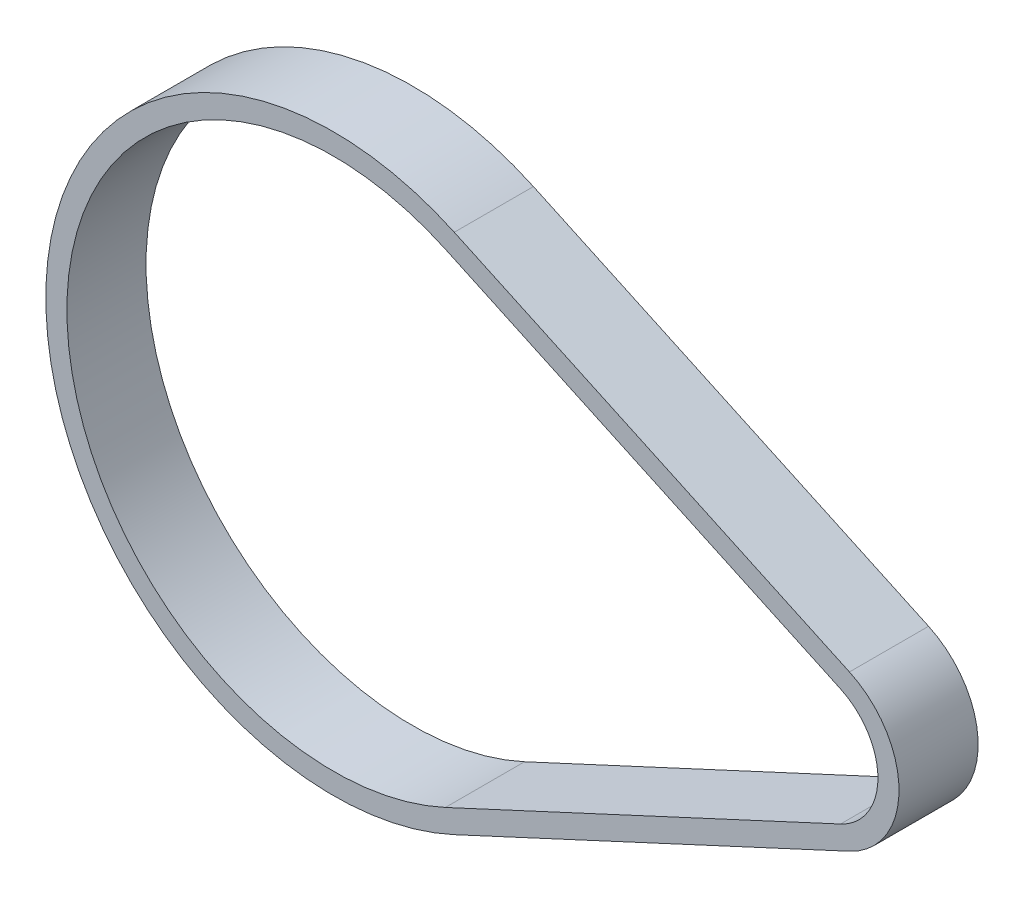
ISO-10303-21;
HEADER;
FILE_DESCRIPTION(('STEP AP214'),'2;1');
FILE_NAME('part.step','',(''),(''),'','','');
FILE_SCHEMA(('AUTOMOTIVE_DESIGN { 1 0 10303 214 1 1 1 1 }'));
ENDSEC;
DATA;
#1=APPLICATION_CONTEXT('core data for automotive mechanical design processes');
#2=APPLICATION_PROTOCOL_DEFINITION('international standard','automotive_design',2000,#1);
#3=PRODUCT_CONTEXT('',#1,'mechanical');
#4=PRODUCT('Part','Part','',(#3));
#5=PRODUCT_RELATED_PRODUCT_CATEGORY('part','',(#4));
#6=PRODUCT_DEFINITION_FORMATION('','',#4);
#7=PRODUCT_DEFINITION_CONTEXT('part definition',#1,'design');
#8=PRODUCT_DEFINITION('design','',#6,#7);
#9=PRODUCT_DEFINITION_SHAPE('','',#8);
#10=(LENGTH_UNIT() NAMED_UNIT(*) SI_UNIT(.MILLI.,.METRE.));
#11=(NAMED_UNIT(*) PLANE_ANGLE_UNIT() SI_UNIT($,.RADIAN.));
#12=(NAMED_UNIT(*) SI_UNIT($,.STERADIAN.) SOLID_ANGLE_UNIT());
#13=UNCERTAINTY_MEASURE_WITH_UNIT(LENGTH_MEASURE(1.E-05),#10,'distance_accuracy_value','');
#14=(GEOMETRIC_REPRESENTATION_CONTEXT(3) GLOBAL_UNCERTAINTY_ASSIGNED_CONTEXT((#13)) GLOBAL_UNIT_ASSIGNED_CONTEXT((#10,
#11,#12)) REPRESENTATION_CONTEXT('',''));
#15=CARTESIAN_POINT('',(0.,0.,0.));
#16=DIRECTION('',(0.,0.,1.));
#17=DIRECTION('',(1.,0.,0.));
#18=AXIS2_PLACEMENT_3D('',#15,#16,#17);
#19=CARTESIAN_POINT('',(-22.75,0.,7.5));
#20=DIRECTION('',(0.,0.,1.));
#21=DIRECTION('',(1.,0.,0.));
#22=AXIS2_PLACEMENT_3D('',#19,#20,#21);
#23=PLANE('',#22);
#24=CARTESIAN_POINT('',(-22.75,0.,7.5));
#25=DIRECTION('',(0.,0.,1.));
#26=DIRECTION('',(1.,0.,0.));
#27=AXIS2_PLACEMENT_3D('',#24,#25,#26);
#28=CIRCLE('',#27,27.25);
#29=CARTESIAN_POINT('',(-11.287032967033,24.7217088163644,7.5));
#30=VERTEX_POINT('',#29);
#31=CARTESIAN_POINT('',(-11.287032967033,-24.7217088163644,7.5));
#32=VERTEX_POINT('',#31);
#33=EDGE_CURVE('E153',#30,#32,#28,.T.);
#34=ORIENTED_EDGE('',*,*,#33,.T.);
#35=DIRECTION('',(0.907218672160163,0.420659340659341,0.));
#36=VECTOR('',#35,1.);
#37=CARTESIAN_POINT('',(26.1615472527473,-7.35754343121891,7.5));
#38=LINE('',#37,#36);
#39=CARTESIAN_POINT('',(26.1615472527473,-7.35754343121891,7.5));
#40=VERTEX_POINT('',#39);
#41=EDGE_CURVE('E157',#32,#40,#38,.T.);
#42=ORIENTED_EDGE('',*,*,#41,.T.);
#43=CARTESIAN_POINT('',(22.75,0.,7.5));
#44=DIRECTION('',(0.,0.,1.));
#45=DIRECTION('',(-1.,0.,0.));
#46=AXIS2_PLACEMENT_3D('',#43,#44,#45);
#47=CIRCLE('',#46,8.11);
#48=CARTESIAN_POINT('',(26.1615472527473,7.35754343121893,7.5));
#49=VERTEX_POINT('',#48);
#50=EDGE_CURVE('E161',#40,#49,#47,.T.);
#51=ORIENTED_EDGE('',*,*,#50,.T.);
#52=DIRECTION('',(-0.907218672160163,0.42065934065934,0.));
#53=VECTOR('',#52,1.);
#54=CARTESIAN_POINT('',(-11.287032967033,24.7217088163644,7.5));
#55=LINE('',#54,#53);
#56=EDGE_CURVE('E164',#49,#30,#55,.T.);
#57=ORIENTED_EDGE('',*,*,#56,.T.);
#58=EDGE_LOOP('',(#34,#42,#51,#57));
#59=FACE_BOUND('',#58,.T.);
#60=DIRECTION('',(0.907218672160163,0.420659340659341,0.));
#61=VECTOR('',#60,1.);
#62=CARTESIAN_POINT('',(25.3202285714286,-5.54310608689859,7.5));
#63=LINE('',#62,#61);
#64=CARTESIAN_POINT('',(-12.1283516483516,-22.9072714720441,7.5));
#65=VERTEX_POINT('',#64);
#66=CARTESIAN_POINT('',(25.3202285714286,-5.54310608689859,7.5));
#67=VERTEX_POINT('',#66);
#68=EDGE_CURVE('E114',#65,#67,#63,.T.);
#69=ORIENTED_EDGE('',*,*,#68,.F.);
#70=CARTESIAN_POINT('',(-22.75,0.,7.5));
#71=DIRECTION('',(0.,0.,1.));
#72=DIRECTION('',(1.,0.,0.));
#73=AXIS2_PLACEMENT_3D('',#70,#71,#72);
#74=CIRCLE('',#73,25.25);
#75=CARTESIAN_POINT('',(-12.1283516483517,22.9072714720441,7.5));
#76=VERTEX_POINT('',#75);
#77=EDGE_CURVE('E105',#76,#65,#74,.T.);
#78=ORIENTED_EDGE('',*,*,#77,.F.);
#79=DIRECTION('',(-0.907218672160163,0.420659340659341,0.));
#80=VECTOR('',#79,1.);
#81=CARTESIAN_POINT('',(-12.1283516483517,22.9072714720441,7.5));
#82=LINE('',#81,#80);
#83=CARTESIAN_POINT('',(25.3202285714286,5.54310608689861,7.5));
#84=VERTEX_POINT('',#83);
#85=EDGE_CURVE('E131',#84,#76,#82,.T.);
#86=ORIENTED_EDGE('',*,*,#85,.F.);
#87=CARTESIAN_POINT('',(22.75,0.,7.5));
#88=DIRECTION('',(0.,0.,1.));
#89=DIRECTION('',(-1.,0.,0.));
#90=AXIS2_PLACEMENT_3D('',#87,#88,#89);
#91=CIRCLE('',#90,6.11000000000001);
#92=EDGE_CURVE('E127',#67,#84,#91,.T.);
#93=ORIENTED_EDGE('',*,*,#92,.F.);
#94=EDGE_LOOP('',(#69,#78,#86,#93));
#95=FACE_BOUND('',#94,.T.);
#96=ADVANCED_FACE('F39',(#59,#95),#23,.T.);
#97=CARTESIAN_POINT('',(-22.75,0.,0.));
#98=DIRECTION('',(0.,0.,1.));
#99=DIRECTION('',(1.,0.,0.));
#100=AXIS2_PLACEMENT_3D('',#97,#98,#99);
#101=PLANE('',#100);
#102=CARTESIAN_POINT('',(-22.75,0.,0.));
#103=DIRECTION('',(0.,0.,1.));
#104=DIRECTION('',(1.,0.,0.));
#105=AXIS2_PLACEMENT_3D('',#102,#103,#104);
#106=CIRCLE('',#105,27.25);
#107=CARTESIAN_POINT('',(-11.287032967033,24.7217088163644,0.));
#108=VERTEX_POINT('',#107);
#109=CARTESIAN_POINT('',(-11.287032967033,-24.7217088163644,0.));
#110=VERTEX_POINT('',#109);
#111=EDGE_CURVE('E123',#108,#110,#106,.T.);
#112=ORIENTED_EDGE('',*,*,#111,.F.);
#113=DIRECTION('',(-0.907218672160163,0.42065934065934,0.));
#114=VECTOR('',#113,1.);
#115=CARTESIAN_POINT('',(-11.287032967033,24.7217088163644,0.));
#116=LINE('',#115,#114);
#117=CARTESIAN_POINT('',(26.1615472527473,7.35754343121893,0.));
#118=VERTEX_POINT('',#117);
#119=EDGE_CURVE('E158',#118,#108,#116,.T.);
#120=ORIENTED_EDGE('',*,*,#119,.F.);
#121=CARTESIAN_POINT('',(22.75,0.,0.));
#122=DIRECTION('',(0.,0.,1.));
#123=DIRECTION('',(-1.,0.,0.));
#124=AXIS2_PLACEMENT_3D('',#121,#122,#123);
#125=CIRCLE('',#124,8.11);
#126=CARTESIAN_POINT('',(26.1615472527473,-7.35754343121891,0.));
#127=VERTEX_POINT('',#126);
#128=EDGE_CURVE('E174',#127,#118,#125,.T.);
#129=ORIENTED_EDGE('',*,*,#128,.F.);
#130=DIRECTION('',(0.907218672160163,0.420659340659341,0.));
#131=VECTOR('',#130,1.);
#132=CARTESIAN_POINT('',(26.1615472527473,-7.35754343121891,0.));
#133=LINE('',#132,#131);
#134=EDGE_CURVE('E171',#110,#127,#133,.T.);
#135=ORIENTED_EDGE('',*,*,#134,.F.);
#136=EDGE_LOOP('',(#112,#120,#129,#135));
#137=FACE_BOUND('',#136,.T.);
#138=CARTESIAN_POINT('',(-22.75,0.,0.));
#139=DIRECTION('',(0.,0.,1.));
#140=DIRECTION('',(1.,0.,0.));
#141=AXIS2_PLACEMENT_3D('',#138,#139,#140);
#142=CIRCLE('',#141,25.25);
#143=CARTESIAN_POINT('',(-12.1283516483517,22.9072714720441,0.));
#144=VERTEX_POINT('',#143);
#145=CARTESIAN_POINT('',(-12.1283516483516,-22.9072714720441,0.));
#146=VERTEX_POINT('',#145);
#147=EDGE_CURVE('E63',#144,#146,#142,.T.);
#148=ORIENTED_EDGE('',*,*,#147,.T.);
#149=DIRECTION('',(0.907218672160163,0.420659340659341,0.));
#150=VECTOR('',#149,1.);
#151=CARTESIAN_POINT('',(25.3202285714286,-5.54310608689859,0.));
#152=LINE('',#151,#150);
#153=CARTESIAN_POINT('',(25.3202285714286,-5.54310608689859,0.));
#154=VERTEX_POINT('',#153);
#155=EDGE_CURVE('E121',#146,#154,#152,.T.);
#156=ORIENTED_EDGE('',*,*,#155,.T.);
#157=CARTESIAN_POINT('',(22.75,0.,0.));
#158=DIRECTION('',(0.,0.,1.));
#159=DIRECTION('',(-1.,0.,0.));
#160=AXIS2_PLACEMENT_3D('',#157,#158,#159);
#161=CIRCLE('',#160,6.11000000000001);
#162=CARTESIAN_POINT('',(25.3202285714286,5.54310608689861,0.));
#163=VERTEX_POINT('',#162);
#164=EDGE_CURVE('E140',#154,#163,#161,.T.);
#165=ORIENTED_EDGE('',*,*,#164,.T.);
#166=DIRECTION('',(-0.907218672160163,0.420659340659341,0.));
#167=VECTOR('',#166,1.);
#168=CARTESIAN_POINT('',(-12.1283516483517,22.9072714720441,0.));
#169=LINE('',#168,#167);
#170=EDGE_CURVE('E115',#163,#144,#169,.T.);
#171=ORIENTED_EDGE('',*,*,#170,.T.);
#172=EDGE_LOOP('',(#148,#156,#165,#171));
#173=FACE_BOUND('',#172,.T.);
#174=ADVANCED_FACE('F197',(#137,#173),#101,.F.);
#175=CARTESIAN_POINT('',(-22.75,0.,7.5));
#176=DIRECTION('',(0.,0.,-1.));
#177=DIRECTION('',(-1.,0.,0.));
#178=AXIS2_PLACEMENT_3D('',#175,#176,#177);
#179=CYLINDRICAL_SURFACE('',#178,27.25);
#180=ORIENTED_EDGE('',*,*,#111,.T.);
#181=DIRECTION('',(0.,0.,-1.));
#182=VECTOR('',#181,1.);
#183=CARTESIAN_POINT('',(-11.287032967033,-24.7217088163644,7.5));
#184=LINE('',#183,#182);
#185=EDGE_CURVE('E11',#32,#110,#184,.T.);
#186=ORIENTED_EDGE('',*,*,#185,.F.);
#187=ORIENTED_EDGE('',*,*,#33,.F.);
#188=DIRECTION('',(0.,0.,-1.));
#189=VECTOR('',#188,1.);
#190=CARTESIAN_POINT('',(-11.287032967033,24.7217088163644,7.5));
#191=LINE('',#190,#189);
#192=EDGE_CURVE('E167',#30,#108,#191,.T.);
#193=ORIENTED_EDGE('',*,*,#192,.T.);
#194=EDGE_LOOP('',(#180,#186,#187,#193));
#195=FACE_BOUND('',#194,.T.);
#196=ADVANCED_FACE('F41',(#195),#179,.T.);
#197=CARTESIAN_POINT('',(26.1615472527473,-7.35754343121891,7.5));
#198=DIRECTION('',(-0.420659340659341,0.907218672160163,0.));
#199=DIRECTION('',(-0.907218672160163,-0.420659340659341,0.));
#200=AXIS2_PLACEMENT_3D('',#197,#198,#199);
#201=PLANE('',#200);
#202=ORIENTED_EDGE('',*,*,#134,.T.);
#203=DIRECTION('',(0.,0.,-1.));
#204=VECTOR('',#203,1.);
#205=CARTESIAN_POINT('',(26.1615472527473,-7.35754343121891,7.5));
#206=LINE('',#205,#204);
#207=EDGE_CURVE('E48',#40,#127,#206,.T.);
#208=ORIENTED_EDGE('',*,*,#207,.F.);
#209=ORIENTED_EDGE('',*,*,#41,.F.);
#210=ORIENTED_EDGE('',*,*,#185,.T.);
#211=EDGE_LOOP('',(#202,#208,#209,#210));
#212=FACE_BOUND('',#211,.T.);
#213=ADVANCED_FACE('F207',(#212),#201,.F.);
#214=CARTESIAN_POINT('',(22.75,0.,7.5));
#215=DIRECTION('',(0.,0.,-1.));
#216=DIRECTION('',(-1.,0.,0.));
#217=AXIS2_PLACEMENT_3D('',#214,#215,#216);
#218=CYLINDRICAL_SURFACE('',#217,8.11);
#219=ORIENTED_EDGE('',*,*,#128,.T.);
#220=DIRECTION('',(0.,0.,-1.));
#221=VECTOR('',#220,1.);
#222=CARTESIAN_POINT('',(26.1615472527473,7.35754343121893,7.5));
#223=LINE('',#222,#221);
#224=EDGE_CURVE('E182',#49,#118,#223,.T.);
#225=ORIENTED_EDGE('',*,*,#224,.F.);
#226=ORIENTED_EDGE('',*,*,#50,.F.);
#227=ORIENTED_EDGE('',*,*,#207,.T.);
#228=EDGE_LOOP('',(#219,#225,#226,#227));
#229=FACE_BOUND('',#228,.T.);
#230=ADVANCED_FACE('F191',(#229),#218,.T.);
#231=CARTESIAN_POINT('',(-11.287032967033,24.7217088163644,7.5));
#232=DIRECTION('',(-0.42065934065934,-0.907218672160163,0.));
#233=DIRECTION('',(0.907218672160163,-0.42065934065934,0.));
#234=AXIS2_PLACEMENT_3D('',#231,#232,#233);
#235=PLANE('',#234);
#236=ORIENTED_EDGE('',*,*,#119,.T.);
#237=ORIENTED_EDGE('',*,*,#192,.F.);
#238=ORIENTED_EDGE('',*,*,#56,.F.);
#239=ORIENTED_EDGE('',*,*,#224,.T.);
#240=EDGE_LOOP('',(#236,#237,#238,#239));
#241=FACE_BOUND('',#240,.T.);
#242=ADVANCED_FACE('F201',(#241),#235,.F.);
#243=CARTESIAN_POINT('',(-22.75,0.,7.5));
#244=DIRECTION('',(0.,0.,-1.));
#245=DIRECTION('',(-1.,0.,0.));
#246=AXIS2_PLACEMENT_3D('',#243,#244,#245);
#247=CYLINDRICAL_SURFACE('',#246,25.25);
#248=ORIENTED_EDGE('',*,*,#147,.F.);
#249=DIRECTION('',(0.,0.,-1.));
#250=VECTOR('',#249,1.);
#251=CARTESIAN_POINT('',(-12.1283516483517,22.9072714720441,7.5));
#252=LINE('',#251,#250);
#253=EDGE_CURVE('E109',#76,#144,#252,.T.);
#254=ORIENTED_EDGE('',*,*,#253,.F.);
#255=ORIENTED_EDGE('',*,*,#77,.T.);
#256=DIRECTION('',(0.,0.,-1.));
#257=VECTOR('',#256,1.);
#258=CARTESIAN_POINT('',(-12.1283516483516,-22.9072714720441,7.5));
#259=LINE('',#258,#257);
#260=EDGE_CURVE('E108',#65,#146,#259,.T.);
#261=ORIENTED_EDGE('',*,*,#260,.T.);
#262=EDGE_LOOP('',(#248,#254,#255,#261));
#263=FACE_BOUND('',#262,.T.);
#264=ADVANCED_FACE('F107',(#263),#247,.F.);
#265=CARTESIAN_POINT('',(25.3202285714286,-5.54310608689859,7.5));
#266=DIRECTION('',(-0.420659340659341,0.907218672160163,0.));
#267=DIRECTION('',(-0.907218672160163,-0.420659340659341,0.));
#268=AXIS2_PLACEMENT_3D('',#265,#266,#267);
#269=PLANE('',#268);
#270=ORIENTED_EDGE('',*,*,#155,.F.);
#271=ORIENTED_EDGE('',*,*,#260,.F.);
#272=ORIENTED_EDGE('',*,*,#68,.T.);
#273=DIRECTION('',(0.,0.,-1.));
#274=VECTOR('',#273,1.);
#275=CARTESIAN_POINT('',(25.3202285714286,-5.54310608689859,7.5));
#276=LINE('',#275,#274);
#277=EDGE_CURVE('E124',#67,#154,#276,.T.);
#278=ORIENTED_EDGE('',*,*,#277,.T.);
#279=EDGE_LOOP('',(#270,#271,#272,#278));
#280=FACE_BOUND('',#279,.T.);
#281=ADVANCED_FACE('F118',(#280),#269,.T.);
#282=CARTESIAN_POINT('',(22.75,0.,7.5));
#283=DIRECTION('',(0.,0.,-1.));
#284=DIRECTION('',(-1.,0.,0.));
#285=AXIS2_PLACEMENT_3D('',#282,#283,#284);
#286=CYLINDRICAL_SURFACE('',#285,6.11000000000001);
#287=ORIENTED_EDGE('',*,*,#164,.F.);
#288=ORIENTED_EDGE('',*,*,#277,.F.);
#289=ORIENTED_EDGE('',*,*,#92,.T.);
#290=DIRECTION('',(0.,0.,-1.));
#291=VECTOR('',#290,1.);
#292=CARTESIAN_POINT('',(25.3202285714286,5.54310608689861,7.5));
#293=LINE('',#292,#291);
#294=EDGE_CURVE('E55',#84,#163,#293,.T.);
#295=ORIENTED_EDGE('',*,*,#294,.T.);
#296=EDGE_LOOP('',(#287,#288,#289,#295));
#297=FACE_BOUND('',#296,.T.);
#298=ADVANCED_FACE('F230',(#297),#286,.F.);
#299=CARTESIAN_POINT('',(-12.1283516483517,22.9072714720441,7.5));
#300=DIRECTION('',(-0.420659340659341,-0.907218672160163,0.));
#301=DIRECTION('',(0.907218672160163,-0.420659340659341,0.));
#302=AXIS2_PLACEMENT_3D('',#299,#300,#301);
#303=PLANE('',#302);
#304=ORIENTED_EDGE('',*,*,#170,.F.);
#305=ORIENTED_EDGE('',*,*,#294,.F.);
#306=ORIENTED_EDGE('',*,*,#85,.T.);
#307=ORIENTED_EDGE('',*,*,#253,.T.);
#308=EDGE_LOOP('',(#304,#305,#306,#307));
#309=FACE_BOUND('',#308,.T.);
#310=ADVANCED_FACE('F234',(#309),#303,.T.);
#311=CLOSED_SHELL('',(#96,#174,#196,#213,#230,#242,#264,#281,#298,#310));
#312=MANIFOLD_SOLID_BREP('B2',#311);
#313=ADVANCED_BREP_SHAPE_REPRESENTATION('',(#18,#312),#14);
#314=SHAPE_DEFINITION_REPRESENTATION(#9,#313);
ENDSEC;
END-ISO-10303-21;
